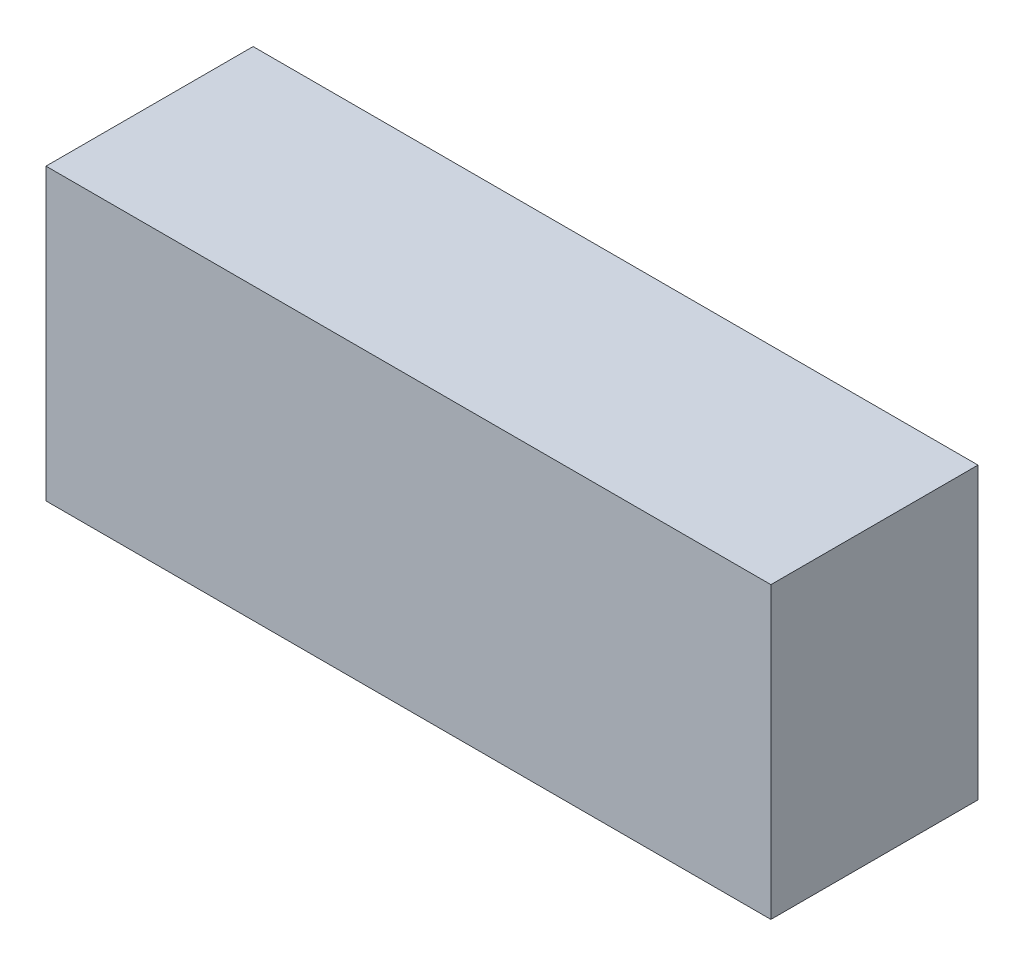
ISO-10303-21;
HEADER;
FILE_DESCRIPTION(('STEP AP214'),'2;1');
FILE_NAME('part.step','',(''),(''),'','','');
FILE_SCHEMA(('AUTOMOTIVE_DESIGN { 1 0 10303 214 1 1 1 1 }'));
ENDSEC;
DATA;
#1=APPLICATION_CONTEXT('core data for automotive mechanical design processes');
#2=APPLICATION_PROTOCOL_DEFINITION('international standard','automotive_design',2000,#1);
#3=PRODUCT_CONTEXT('',#1,'mechanical');
#4=PRODUCT('Part','Part','',(#3));
#5=PRODUCT_RELATED_PRODUCT_CATEGORY('part','',(#4));
#6=PRODUCT_DEFINITION_FORMATION('','',#4);
#7=PRODUCT_DEFINITION_CONTEXT('part definition',#1,'design');
#8=PRODUCT_DEFINITION('design','',#6,#7);
#9=PRODUCT_DEFINITION_SHAPE('','',#8);
#10=(LENGTH_UNIT() NAMED_UNIT(*) SI_UNIT(.MILLI.,.METRE.));
#11=(NAMED_UNIT(*) PLANE_ANGLE_UNIT() SI_UNIT($,.RADIAN.));
#12=(NAMED_UNIT(*) SI_UNIT($,.STERADIAN.) SOLID_ANGLE_UNIT());
#13=UNCERTAINTY_MEASURE_WITH_UNIT(LENGTH_MEASURE(1.E-05),#10,'distance_accuracy_value','');
#14=(GEOMETRIC_REPRESENTATION_CONTEXT(3) GLOBAL_UNCERTAINTY_ASSIGNED_CONTEXT((#13)) GLOBAL_UNIT_ASSIGNED_CONTEXT((#10,
#11,#12)) REPRESENTATION_CONTEXT('',''));
#15=CARTESIAN_POINT('',(0.,0.,0.));
#16=DIRECTION('',(0.,0.,1.));
#17=DIRECTION('',(1.,0.,0.));
#18=AXIS2_PLACEMENT_3D('',#15,#16,#17);
#19=CARTESIAN_POINT('',(-35.,-14.,20.));
#20=DIRECTION('',(1.,0.,0.));
#21=DIRECTION('',(0.,0.,-1.));
#22=AXIS2_PLACEMENT_3D('',#19,#20,#21);
#23=PLANE('',#22);
#24=DIRECTION('',(0.,-1.,0.));
#25=VECTOR('',#24,1.);
#26=CARTESIAN_POINT('',(-35.,-14.,0.));
#27=LINE('',#26,#25);
#28=CARTESIAN_POINT('',(-35.,14.,0.));
#29=VERTEX_POINT('',#28);
#30=CARTESIAN_POINT('',(-35.,-14.,0.));
#31=VERTEX_POINT('',#30);
#32=EDGE_CURVE('E102',#29,#31,#27,.T.);
#33=ORIENTED_EDGE('',*,*,#32,.T.);
#34=DIRECTION('',(0.,0.,-1.));
#35=VECTOR('',#34,1.);
#36=CARTESIAN_POINT('',(-35.,-14.,20.));
#37=LINE('',#36,#35);
#38=CARTESIAN_POINT('',(-35.,-14.,20.));
#39=VERTEX_POINT('',#38);
#40=EDGE_CURVE('E11',#39,#31,#37,.T.);
#41=ORIENTED_EDGE('',*,*,#40,.F.);
#42=DIRECTION('',(0.,-1.,0.));
#43=VECTOR('',#42,1.);
#44=CARTESIAN_POINT('',(-35.,-14.,20.));
#45=LINE('',#44,#43);
#46=CARTESIAN_POINT('',(-35.,14.,20.));
#47=VERTEX_POINT('',#46);
#48=EDGE_CURVE('E90',#47,#39,#45,.T.);
#49=ORIENTED_EDGE('',*,*,#48,.F.);
#50=DIRECTION('',(0.,0.,-1.));
#51=VECTOR('',#50,1.);
#52=CARTESIAN_POINT('',(-35.,14.,20.));
#53=LINE('',#52,#51);
#54=EDGE_CURVE('E98',#47,#29,#53,.T.);
#55=ORIENTED_EDGE('',*,*,#54,.T.);
#56=EDGE_LOOP('',(#33,#41,#49,#55));
#57=FACE_BOUND('',#56,.T.);
#58=ADVANCED_FACE('F39',(#57),#23,.F.);
#59=CARTESIAN_POINT('',(-35.,-14.,20.));
#60=DIRECTION('',(0.,1.,0.));
#61=DIRECTION('',(0.,0.,1.));
#62=AXIS2_PLACEMENT_3D('',#59,#60,#61);
#63=PLANE('',#62);
#64=DIRECTION('',(1.,0.,0.));
#65=VECTOR('',#64,1.);
#66=CARTESIAN_POINT('',(-35.,-14.,0.));
#67=LINE('',#66,#65);
#68=CARTESIAN_POINT('',(35.,-14.,0.));
#69=VERTEX_POINT('',#68);
#70=EDGE_CURVE('E94',#31,#69,#67,.T.);
#71=ORIENTED_EDGE('',*,*,#70,.T.);
#72=DIRECTION('',(0.,0.,-1.));
#73=VECTOR('',#72,1.);
#74=CARTESIAN_POINT('',(35.,-14.,20.));
#75=LINE('',#74,#73);
#76=CARTESIAN_POINT('',(35.,-14.,20.));
#77=VERTEX_POINT('',#76);
#78=EDGE_CURVE('E47',#77,#69,#75,.T.);
#79=ORIENTED_EDGE('',*,*,#78,.F.);
#80=DIRECTION('',(1.,0.,0.));
#81=VECTOR('',#80,1.);
#82=CARTESIAN_POINT('',(-35.,-14.,20.));
#83=LINE('',#82,#81);
#84=EDGE_CURVE('E85',#39,#77,#83,.T.);
#85=ORIENTED_EDGE('',*,*,#84,.F.);
#86=ORIENTED_EDGE('',*,*,#40,.T.);
#87=EDGE_LOOP('',(#71,#79,#85,#86));
#88=FACE_BOUND('',#87,.T.);
#89=ADVANCED_FACE('F93',(#88),#63,.F.);
#90=CARTESIAN_POINT('',(35.,-14.,20.));
#91=DIRECTION('',(-1.,0.,0.));
#92=DIRECTION('',(0.,0.,1.));
#93=AXIS2_PLACEMENT_3D('',#90,#91,#92);
#94=PLANE('',#93);
#95=DIRECTION('',(0.,1.,0.));
#96=VECTOR('',#95,1.);
#97=CARTESIAN_POINT('',(35.,-14.,0.));
#98=LINE('',#97,#96);
#99=CARTESIAN_POINT('',(35.,14.,0.));
#100=VERTEX_POINT('',#99);
#101=EDGE_CURVE('E72',#69,#100,#98,.T.);
#102=ORIENTED_EDGE('',*,*,#101,.T.);
#103=DIRECTION('',(0.,0.,-1.));
#104=VECTOR('',#103,1.);
#105=CARTESIAN_POINT('',(35.,14.,20.));
#106=LINE('',#105,#104);
#107=CARTESIAN_POINT('',(35.,14.,20.));
#108=VERTEX_POINT('',#107);
#109=EDGE_CURVE('E95',#108,#100,#106,.T.);
#110=ORIENTED_EDGE('',*,*,#109,.F.);
#111=DIRECTION('',(0.,1.,0.));
#112=VECTOR('',#111,1.);
#113=CARTESIAN_POINT('',(35.,-14.,20.));
#114=LINE('',#113,#112);
#115=EDGE_CURVE('E88',#77,#108,#114,.T.);
#116=ORIENTED_EDGE('',*,*,#115,.F.);
#117=ORIENTED_EDGE('',*,*,#78,.T.);
#118=EDGE_LOOP('',(#102,#110,#116,#117));
#119=FACE_BOUND('',#118,.T.);
#120=ADVANCED_FACE('F96',(#119),#94,.F.);
#121=CARTESIAN_POINT('',(-35.,14.,20.));
#122=DIRECTION('',(0.,-1.,0.));
#123=DIRECTION('',(0.,0.,-1.));
#124=AXIS2_PLACEMENT_3D('',#121,#122,#123);
#125=PLANE('',#124);
#126=DIRECTION('',(-1.,0.,0.));
#127=VECTOR('',#126,1.);
#128=CARTESIAN_POINT('',(-35.,14.,0.));
#129=LINE('',#128,#127);
#130=EDGE_CURVE('E78',#100,#29,#129,.T.);
#131=ORIENTED_EDGE('',*,*,#130,.T.);
#132=ORIENTED_EDGE('',*,*,#54,.F.);
#133=DIRECTION('',(-1.,0.,0.));
#134=VECTOR('',#133,1.);
#135=CARTESIAN_POINT('',(-35.,14.,20.));
#136=LINE('',#135,#134);
#137=EDGE_CURVE('E55',#108,#47,#136,.T.);
#138=ORIENTED_EDGE('',*,*,#137,.F.);
#139=ORIENTED_EDGE('',*,*,#109,.T.);
#140=EDGE_LOOP('',(#131,#132,#138,#139));
#141=FACE_BOUND('',#140,.T.);
#142=ADVANCED_FACE('F109',(#141),#125,.F.);
#143=CARTESIAN_POINT('',(0.,0.,20.));
#144=DIRECTION('',(0.,0.,-1.));
#145=DIRECTION('',(-1.,0.,0.));
#146=AXIS2_PLACEMENT_3D('',#143,#144,#145);
#147=PLANE('',#146);
#148=ORIENTED_EDGE('',*,*,#48,.T.);
#149=ORIENTED_EDGE('',*,*,#84,.T.);
#150=ORIENTED_EDGE('',*,*,#115,.T.);
#151=ORIENTED_EDGE('',*,*,#137,.T.);
#152=EDGE_LOOP('',(#148,#149,#150,#151));
#153=FACE_BOUND('',#152,.T.);
#154=ADVANCED_FACE('F86',(#153),#147,.F.);
#155=CARTESIAN_POINT('',(0.,0.,0.));
#156=DIRECTION('',(0.,0.,-1.));
#157=DIRECTION('',(-1.,0.,0.));
#158=AXIS2_PLACEMENT_3D('',#155,#156,#157);
#159=PLANE('',#158);
#160=ORIENTED_EDGE('',*,*,#32,.F.);
#161=ORIENTED_EDGE('',*,*,#130,.F.);
#162=ORIENTED_EDGE('',*,*,#101,.F.);
#163=ORIENTED_EDGE('',*,*,#70,.F.);
#164=EDGE_LOOP('',(#160,#161,#162,#163));
#165=FACE_BOUND('',#164,.T.);
#166=ADVANCED_FACE('F112',(#165),#159,.T.);
#167=CLOSED_SHELL('',(#58,#89,#120,#142,#154,#166));
#168=MANIFOLD_SOLID_BREP('B2',#167);
#169=ADVANCED_BREP_SHAPE_REPRESENTATION('',(#18,#168),#14);
#170=SHAPE_DEFINITION_REPRESENTATION(#9,#169);
ENDSEC;
END-ISO-10303-21;
